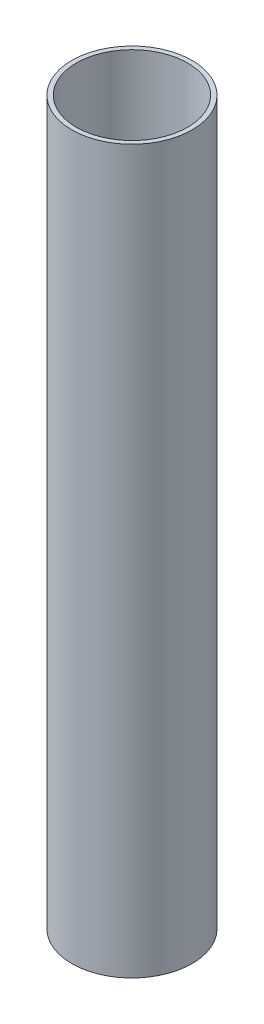
ISO-10303-21;
HEADER;
FILE_DESCRIPTION(('STEP AP214'),'2;1');
FILE_NAME('part.step','',(''),(''),'','','');
FILE_SCHEMA(('AUTOMOTIVE_DESIGN { 1 0 10303 214 1 1 1 1 }'));
ENDSEC;
DATA;
#1=APPLICATION_CONTEXT('core data for automotive mechanical design processes');
#2=APPLICATION_PROTOCOL_DEFINITION('international standard','automotive_design',2000,#1);
#3=PRODUCT_CONTEXT('',#1,'mechanical');
#4=PRODUCT('Part','Part','',(#3));
#5=PRODUCT_RELATED_PRODUCT_CATEGORY('part','',(#4));
#6=PRODUCT_DEFINITION_FORMATION('','',#4);
#7=PRODUCT_DEFINITION_CONTEXT('part definition',#1,'design');
#8=PRODUCT_DEFINITION('design','',#6,#7);
#9=PRODUCT_DEFINITION_SHAPE('','',#8);
#10=(LENGTH_UNIT() NAMED_UNIT(*) SI_UNIT(.MILLI.,.METRE.));
#11=(NAMED_UNIT(*) PLANE_ANGLE_UNIT() SI_UNIT($,.RADIAN.));
#12=(NAMED_UNIT(*) SI_UNIT($,.STERADIAN.) SOLID_ANGLE_UNIT());
#13=UNCERTAINTY_MEASURE_WITH_UNIT(LENGTH_MEASURE(1.E-05),#10,'distance_accuracy_value','');
#14=(GEOMETRIC_REPRESENTATION_CONTEXT(3) GLOBAL_UNCERTAINTY_ASSIGNED_CONTEXT((#13)) GLOBAL_UNIT_ASSIGNED_CONTEXT((#10,
#11,#12)) REPRESENTATION_CONTEXT('',''));
#15=CARTESIAN_POINT('',(0.,0.,0.));
#16=DIRECTION('',(0.,0.,1.));
#17=DIRECTION('',(1.,0.,0.));
#18=AXIS2_PLACEMENT_3D('',#15,#16,#17);
#19=CARTESIAN_POINT('',(0.,114.3,0.));
#20=DIRECTION('',(0.,1.,0.));
#21=DIRECTION('',(0.,0.,1.));
#22=AXIS2_PLACEMENT_3D('',#19,#20,#21);
#23=PLANE('',#22);
#24=CARTESIAN_POINT('',(0.,114.3,0.));
#25=DIRECTION('',(0.,1.,0.));
#26=DIRECTION('',(0.,0.,1.));
#27=AXIS2_PLACEMENT_3D('',#24,#25,#26);
#28=CIRCLE('',#27,9.525);
#29=CARTESIAN_POINT('',(0.,114.3,9.525));
#30=VERTEX_POINT('',#29);
#31=EDGE_CURVE('E10',#30,#30,#28,.T.);
#32=ORIENTED_EDGE('',*,*,#31,.T.);
#33=EDGE_LOOP('',(#32));
#34=FACE_BOUND('',#33,.T.);
#35=CARTESIAN_POINT('',(0.,114.3,0.));
#36=DIRECTION('',(0.,1.,0.));
#37=DIRECTION('',(0.,0.,1.));
#38=AXIS2_PLACEMENT_3D('',#35,#36,#37);
#39=CIRCLE('',#38,8.8138);
#40=CARTESIAN_POINT('',(0.,114.3,8.8138));
#41=VERTEX_POINT('',#40);
#42=EDGE_CURVE('E44',#41,#41,#39,.T.);
#43=ORIENTED_EDGE('',*,*,#42,.F.);
#44=EDGE_LOOP('',(#43));
#45=FACE_BOUND('',#44,.T.);
#46=ADVANCED_FACE('F33',(#34,#45),#23,.T.);
#47=CARTESIAN_POINT('',(0.,0.,0.));
#48=DIRECTION('',(0.,1.,0.));
#49=DIRECTION('',(0.,0.,1.));
#50=AXIS2_PLACEMENT_3D('',#47,#48,#49);
#51=PLANE('',#50);
#52=CARTESIAN_POINT('',(0.,0.,0.));
#53=DIRECTION('',(0.,1.,0.));
#54=DIRECTION('',(0.,0.,1.));
#55=AXIS2_PLACEMENT_3D('',#52,#53,#54);
#56=CIRCLE('',#55,9.525);
#57=CARTESIAN_POINT('',(0.,0.,9.525));
#58=VERTEX_POINT('',#57);
#59=EDGE_CURVE('E37',#58,#58,#56,.T.);
#60=ORIENTED_EDGE('',*,*,#59,.F.);
#61=EDGE_LOOP('',(#60));
#62=FACE_BOUND('',#61,.T.);
#63=CARTESIAN_POINT('',(0.,0.,0.));
#64=DIRECTION('',(0.,1.,0.));
#65=DIRECTION('',(0.,0.,1.));
#66=AXIS2_PLACEMENT_3D('',#63,#64,#65);
#67=CIRCLE('',#66,8.8138);
#68=CARTESIAN_POINT('',(0.,0.,8.8138));
#69=VERTEX_POINT('',#68);
#70=EDGE_CURVE('E46',#69,#69,#67,.T.);
#71=ORIENTED_EDGE('',*,*,#70,.T.);
#72=EDGE_LOOP('',(#71));
#73=FACE_BOUND('',#72,.T.);
#74=ADVANCED_FACE('F56',(#62,#73),#51,.F.);
#75=CARTESIAN_POINT('',(0.,114.3,0.));
#76=DIRECTION('',(0.,-1.,0.));
#77=DIRECTION('',(0.,0.,-1.));
#78=AXIS2_PLACEMENT_3D('',#75,#76,#77);
#79=CYLINDRICAL_SURFACE('',#78,9.525);
#80=ORIENTED_EDGE('',*,*,#31,.F.);
#81=EDGE_LOOP('',(#80));
#82=FACE_BOUND('',#81,.T.);
#83=ORIENTED_EDGE('',*,*,#59,.T.);
#84=EDGE_LOOP('',(#83));
#85=FACE_BOUND('',#84,.T.);
#86=ADVANCED_FACE('F35',(#82,#85),#79,.T.);
#87=CARTESIAN_POINT('',(0.,114.3,0.));
#88=DIRECTION('',(0.,-1.,0.));
#89=DIRECTION('',(0.,0.,-1.));
#90=AXIS2_PLACEMENT_3D('',#87,#88,#89);
#91=CYLINDRICAL_SURFACE('',#90,8.8138);
#92=ORIENTED_EDGE('',*,*,#42,.T.);
#93=EDGE_LOOP('',(#92));
#94=FACE_BOUND('',#93,.T.);
#95=ORIENTED_EDGE('',*,*,#70,.F.);
#96=EDGE_LOOP('',(#95));
#97=FACE_BOUND('',#96,.T.);
#98=ADVANCED_FACE('F52',(#94,#97),#91,.F.);
#99=CLOSED_SHELL('',(#46,#74,#86,#98));
#100=MANIFOLD_SOLID_BREP('B2',#99);
#101=ADVANCED_BREP_SHAPE_REPRESENTATION('',(#18,#100),#14);
#102=SHAPE_DEFINITION_REPRESENTATION(#9,#101);
ENDSEC;
END-ISO-10303-21;
